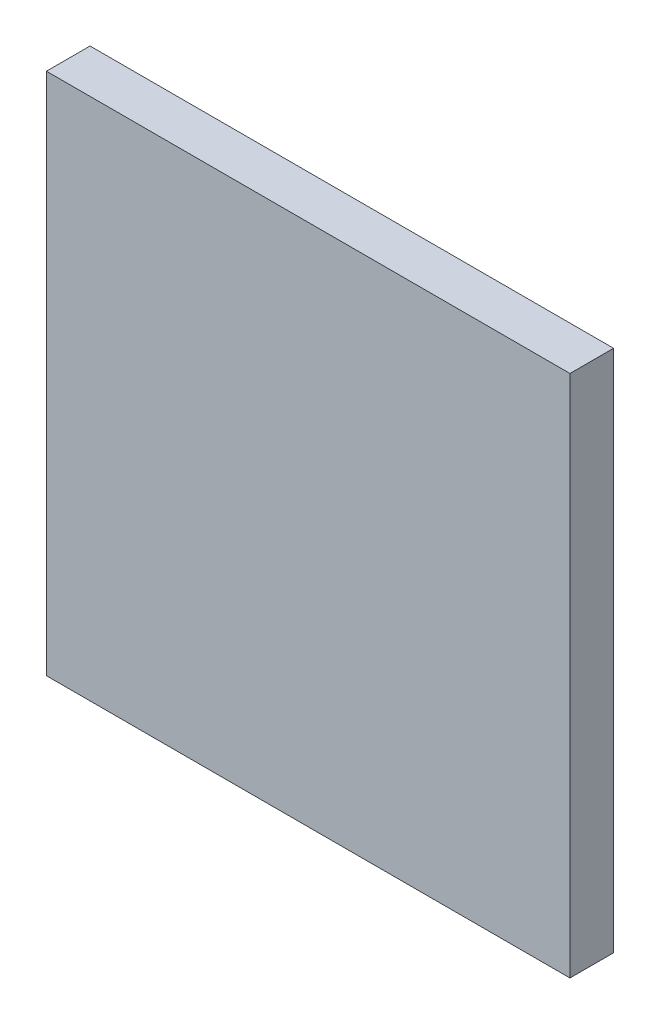
ISO-10303-21;
HEADER;
FILE_DESCRIPTION(('STEP AP214'),'2;1');
FILE_NAME('part.step','',(''),(''),'','','');
FILE_SCHEMA(('AUTOMOTIVE_DESIGN { 1 0 10303 214 1 1 1 1 }'));
ENDSEC;
DATA;
#1=APPLICATION_CONTEXT('core data for automotive mechanical design processes');
#2=APPLICATION_PROTOCOL_DEFINITION('international standard','automotive_design',2000,#1);
#3=PRODUCT_CONTEXT('',#1,'mechanical');
#4=PRODUCT('Part','Part','',(#3));
#5=PRODUCT_RELATED_PRODUCT_CATEGORY('part','',(#4));
#6=PRODUCT_DEFINITION_FORMATION('','',#4);
#7=PRODUCT_DEFINITION_CONTEXT('part definition',#1,'design');
#8=PRODUCT_DEFINITION('design','',#6,#7);
#9=PRODUCT_DEFINITION_SHAPE('','',#8);
#10=(LENGTH_UNIT() NAMED_UNIT(*) SI_UNIT(.MILLI.,.METRE.));
#11=(NAMED_UNIT(*) PLANE_ANGLE_UNIT() SI_UNIT($,.RADIAN.));
#12=(NAMED_UNIT(*) SI_UNIT($,.STERADIAN.) SOLID_ANGLE_UNIT());
#13=UNCERTAINTY_MEASURE_WITH_UNIT(LENGTH_MEASURE(1.E-05),#10,'distance_accuracy_value','');
#14=(GEOMETRIC_REPRESENTATION_CONTEXT(3) GLOBAL_UNCERTAINTY_ASSIGNED_CONTEXT((#13)) GLOBAL_UNIT_ASSIGNED_CONTEXT((#10,
#11,#12)) REPRESENTATION_CONTEXT('',''));
#15=CARTESIAN_POINT('',(0.,0.,0.));
#16=DIRECTION('',(0.,0.,1.));
#17=DIRECTION('',(1.,0.,0.));
#18=AXIS2_PLACEMENT_3D('',#15,#16,#17);
#19=CARTESIAN_POINT('',(-79.9210191082802,48.615923566879,6.35));
#20=DIRECTION('',(1.,0.,0.));
#21=DIRECTION('',(0.,0.,-1.));
#22=AXIS2_PLACEMENT_3D('',#19,#20,#21);
#23=PLANE('',#22);
#24=DIRECTION('',(0.,-1.,0.));
#25=VECTOR('',#24,1.);
#26=CARTESIAN_POINT('',(-79.9210191082802,48.615923566879,0.));
#27=LINE('',#26,#25);
#28=CARTESIAN_POINT('',(-79.9210191082802,48.615923566879,0.));
#29=VERTEX_POINT('',#28);
#30=CARTESIAN_POINT('',(-79.9210191082802,-27.584076433121,0.));
#31=VERTEX_POINT('',#30);
#32=EDGE_CURVE('E107',#29,#31,#27,.T.);
#33=ORIENTED_EDGE('',*,*,#32,.T.);
#34=DIRECTION('',(0.,0.,-1.));
#35=VECTOR('',#34,1.);
#36=CARTESIAN_POINT('',(-79.9210191082802,-27.584076433121,6.35));
#37=LINE('',#36,#35);
#38=CARTESIAN_POINT('',(-79.9210191082802,-27.584076433121,6.35));
#39=VERTEX_POINT('',#38);
#40=EDGE_CURVE('E11',#39,#31,#37,.T.);
#41=ORIENTED_EDGE('',*,*,#40,.F.);
#42=DIRECTION('',(0.,-1.,0.));
#43=VECTOR('',#42,1.);
#44=CARTESIAN_POINT('',(-79.9210191082802,48.615923566879,6.35));
#45=LINE('',#44,#43);
#46=CARTESIAN_POINT('',(-79.9210191082802,48.615923566879,6.35));
#47=VERTEX_POINT('',#46);
#48=EDGE_CURVE('E91',#47,#39,#45,.T.);
#49=ORIENTED_EDGE('',*,*,#48,.F.);
#50=DIRECTION('',(0.,0.,-1.));
#51=VECTOR('',#50,1.);
#52=CARTESIAN_POINT('',(-79.9210191082802,48.615923566879,6.35));
#53=LINE('',#52,#51);
#54=EDGE_CURVE('E103',#47,#29,#53,.T.);
#55=ORIENTED_EDGE('',*,*,#54,.T.);
#56=EDGE_LOOP('',(#33,#41,#49,#55));
#57=FACE_BOUND('',#56,.T.);
#58=ADVANCED_FACE('F39',(#57),#23,.F.);
#59=CARTESIAN_POINT('',(-79.9210191082802,-27.584076433121,6.35));
#60=DIRECTION('',(0.,1.,0.));
#61=DIRECTION('',(-1.,0.,0.));
#62=AXIS2_PLACEMENT_3D('',#59,#60,#61);
#63=PLANE('',#62);
#64=DIRECTION('',(1.,0.,0.));
#65=VECTOR('',#64,1.);
#66=CARTESIAN_POINT('',(-79.9210191082802,-27.584076433121,0.));
#67=LINE('',#66,#65);
#68=CARTESIAN_POINT('',(-3.72101910828022,-27.584076433121,0.));
#69=VERTEX_POINT('',#68);
#70=EDGE_CURVE('E96',#31,#69,#67,.T.);
#71=ORIENTED_EDGE('',*,*,#70,.T.);
#72=DIRECTION('',(0.,0.,-1.));
#73=VECTOR('',#72,1.);
#74=CARTESIAN_POINT('',(-3.72101910828022,-27.584076433121,6.35));
#75=LINE('',#74,#73);
#76=CARTESIAN_POINT('',(-3.72101910828022,-27.584076433121,6.35));
#77=VERTEX_POINT('',#76);
#78=EDGE_CURVE('E48',#77,#69,#75,.T.);
#79=ORIENTED_EDGE('',*,*,#78,.F.);
#80=DIRECTION('',(1.,0.,0.));
#81=VECTOR('',#80,1.);
#82=CARTESIAN_POINT('',(-79.9210191082802,-27.584076433121,6.35));
#83=LINE('',#82,#81);
#84=EDGE_CURVE('E86',#39,#77,#83,.T.);
#85=ORIENTED_EDGE('',*,*,#84,.F.);
#86=ORIENTED_EDGE('',*,*,#40,.T.);
#87=EDGE_LOOP('',(#71,#79,#85,#86));
#88=FACE_BOUND('',#87,.T.);
#89=ADVANCED_FACE('F95',(#88),#63,.F.);
#90=CARTESIAN_POINT('',(-3.72101910828024,48.615923566879,6.35));
#91=DIRECTION('',(-1.,0.,0.));
#92=DIRECTION('',(0.,-1.,0.));
#93=AXIS2_PLACEMENT_3D('',#90,#91,#92);
#94=PLANE('',#93);
#95=DIRECTION('',(0.,1.,0.));
#96=VECTOR('',#95,1.);
#97=CARTESIAN_POINT('',(-3.72101910828024,48.615923566879,0.));
#98=LINE('',#97,#96);
#99=CARTESIAN_POINT('',(-3.72101910828024,48.615923566879,0.));
#100=VERTEX_POINT('',#99);
#101=EDGE_CURVE('E73',#69,#100,#98,.T.);
#102=ORIENTED_EDGE('',*,*,#101,.T.);
#103=DIRECTION('',(0.,0.,-1.));
#104=VECTOR('',#103,1.);
#105=CARTESIAN_POINT('',(-3.72101910828024,48.615923566879,6.35));
#106=LINE('',#105,#104);
#107=CARTESIAN_POINT('',(-3.72101910828024,48.615923566879,6.35));
#108=VERTEX_POINT('',#107);
#109=EDGE_CURVE('E98',#108,#100,#106,.T.);
#110=ORIENTED_EDGE('',*,*,#109,.F.);
#111=DIRECTION('',(0.,1.,0.));
#112=VECTOR('',#111,1.);
#113=CARTESIAN_POINT('',(-3.72101910828024,48.615923566879,6.35));
#114=LINE('',#113,#112);
#115=EDGE_CURVE('E89',#77,#108,#114,.T.);
#116=ORIENTED_EDGE('',*,*,#115,.F.);
#117=ORIENTED_EDGE('',*,*,#78,.T.);
#118=EDGE_LOOP('',(#102,#110,#116,#117));
#119=FACE_BOUND('',#118,.T.);
#120=ADVANCED_FACE('F99',(#119),#94,.F.);
#121=CARTESIAN_POINT('',(-79.9210191082802,48.615923566879,6.35));
#122=DIRECTION('',(0.,-1.,0.));
#123=DIRECTION('',(0.,0.,-1.));
#124=AXIS2_PLACEMENT_3D('',#121,#122,#123);
#125=PLANE('',#124);
#126=DIRECTION('',(-1.,0.,0.));
#127=VECTOR('',#126,1.);
#128=CARTESIAN_POINT('',(-79.9210191082802,48.615923566879,0.));
#129=LINE('',#128,#127);
#130=EDGE_CURVE('E79',#100,#29,#129,.T.);
#131=ORIENTED_EDGE('',*,*,#130,.T.);
#132=ORIENTED_EDGE('',*,*,#54,.F.);
#133=DIRECTION('',(-1.,0.,0.));
#134=VECTOR('',#133,1.);
#135=CARTESIAN_POINT('',(-79.9210191082802,48.615923566879,6.35));
#136=LINE('',#135,#134);
#137=EDGE_CURVE('E56',#108,#47,#136,.T.);
#138=ORIENTED_EDGE('',*,*,#137,.F.);
#139=ORIENTED_EDGE('',*,*,#109,.T.);
#140=EDGE_LOOP('',(#131,#132,#138,#139));
#141=FACE_BOUND('',#140,.T.);
#142=ADVANCED_FACE('F120',(#141),#125,.F.);
#143=CARTESIAN_POINT('',(0.,0.,6.35));
#144=DIRECTION('',(0.,0.,1.));
#145=DIRECTION('',(1.,0.,0.));
#146=AXIS2_PLACEMENT_3D('',#143,#144,#145);
#147=PLANE('',#146);
#148=ORIENTED_EDGE('',*,*,#48,.T.);
#149=ORIENTED_EDGE('',*,*,#84,.T.);
#150=ORIENTED_EDGE('',*,*,#115,.T.);
#151=ORIENTED_EDGE('',*,*,#137,.T.);
#152=EDGE_LOOP('',(#148,#149,#150,#151));
#153=FACE_BOUND('',#152,.T.);
#154=ADVANCED_FACE('F87',(#153),#147,.T.);
#155=CARTESIAN_POINT('',(0.,0.,0.));
#156=DIRECTION('',(0.,0.,1.));
#157=DIRECTION('',(1.,0.,0.));
#158=AXIS2_PLACEMENT_3D('',#155,#156,#157);
#159=PLANE('',#158);
#160=ORIENTED_EDGE('',*,*,#32,.F.);
#161=ORIENTED_EDGE('',*,*,#130,.F.);
#162=ORIENTED_EDGE('',*,*,#101,.F.);
#163=ORIENTED_EDGE('',*,*,#70,.F.);
#164=EDGE_LOOP('',(#160,#161,#162,#163));
#165=FACE_BOUND('',#164,.T.);
#166=ADVANCED_FACE('F123',(#165),#159,.F.);
#167=CLOSED_SHELL('',(#58,#89,#120,#142,#154,#166));
#168=MANIFOLD_SOLID_BREP('B2',#167);
#169=ADVANCED_BREP_SHAPE_REPRESENTATION('',(#18,#168),#14);
#170=SHAPE_DEFINITION_REPRESENTATION(#9,#169);
ENDSEC;
END-ISO-10303-21;
